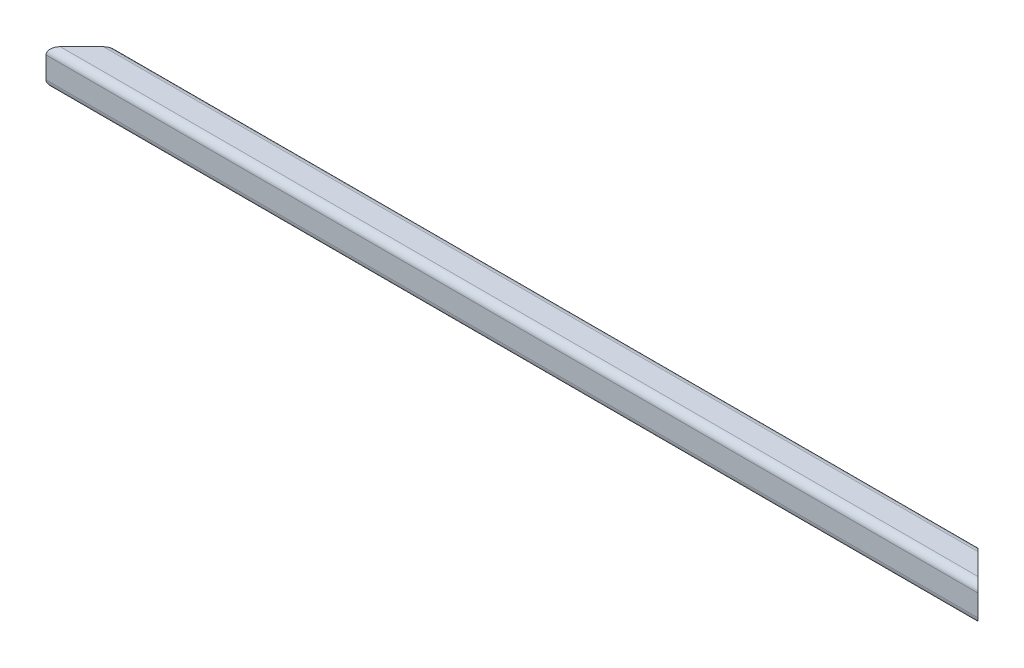
ISO-10303-21;
HEADER;
FILE_DESCRIPTION(('STEP AP214'),'2;1');
FILE_NAME('part.step','',(''),(''),'','','');
FILE_SCHEMA(('AUTOMOTIVE_DESIGN { 1 0 10303 214 1 1 1 1 }'));
ENDSEC;
DATA;
#1=APPLICATION_CONTEXT('core data for automotive mechanical design processes');
#2=APPLICATION_PROTOCOL_DEFINITION('international standard','automotive_design',2000,#1);
#3=PRODUCT_CONTEXT('',#1,'mechanical');
#4=PRODUCT('Part','Part','',(#3));
#5=PRODUCT_RELATED_PRODUCT_CATEGORY('part','',(#4));
#6=PRODUCT_DEFINITION_FORMATION('','',#4);
#7=PRODUCT_DEFINITION_CONTEXT('part definition',#1,'design');
#8=PRODUCT_DEFINITION('design','',#6,#7);
#9=PRODUCT_DEFINITION_SHAPE('','',#8);
#10=(LENGTH_UNIT() NAMED_UNIT(*) SI_UNIT(.MILLI.,.METRE.));
#11=(NAMED_UNIT(*) PLANE_ANGLE_UNIT() SI_UNIT($,.RADIAN.));
#12=(NAMED_UNIT(*) SI_UNIT($,.STERADIAN.) SOLID_ANGLE_UNIT());
#13=UNCERTAINTY_MEASURE_WITH_UNIT(LENGTH_MEASURE(1.E-05),#10,'distance_accuracy_value','');
#14=(GEOMETRIC_REPRESENTATION_CONTEXT(3) GLOBAL_UNCERTAINTY_ASSIGNED_CONTEXT((#13)) GLOBAL_UNIT_ASSIGNED_CONTEXT((#10,
#11,#12)) REPRESENTATION_CONTEXT('',''));
#15=CARTESIAN_POINT('',(0.,0.,0.));
#16=DIRECTION('',(0.,0.,1.));
#17=DIRECTION('',(1.,0.,0.));
#18=AXIS2_PLACEMENT_3D('',#15,#16,#17);
#19=CARTESIAN_POINT('',(-250.,226.,-1994.));
#20=DIRECTION('',(1.,0.,0.));
#21=DIRECTION('',(0.,0.,-1.));
#22=AXIS2_PLACEMENT_3D('',#19,#20,#21);
#23=CYLINDRICAL_SURFACE('',#22,4.);
#24=CARTESIAN_POINT('',(256.,226.,-1994.));
#25=DIRECTION('',(0.707106781186548,0.,-0.707106781186548));
#26=DIRECTION('',(0.707106781186547,0.,0.707106781186548));
#27=AXIS2_PLACEMENT_3D('',#24,#25,#26);
#28=ELLIPSE('',#27,5.65685424949238,4.);
#29=CARTESIAN_POINT('',(256.,230.,-1994.));
#30=VERTEX_POINT('',#29);
#31=CARTESIAN_POINT('',(260.,226.,-1990.));
#32=VERTEX_POINT('',#31);
#33=EDGE_CURVE('E185',#30,#32,#28,.T.);
#34=ORIENTED_EDGE('',*,*,#33,.F.);
#35=DIRECTION('',(1.,0.,0.));
#36=VECTOR('',#35,1.);
#37=CARTESIAN_POINT('',(-250.,230.,-1994.));
#38=LINE('',#37,#36);
#39=CARTESIAN_POINT('',(-256.,230.,-1994.));
#40=VERTEX_POINT('',#39);
#41=EDGE_CURVE('E265',#40,#30,#38,.T.);
#42=ORIENTED_EDGE('',*,*,#41,.F.);
#43=CARTESIAN_POINT('',(-256.,226.,-1994.));
#44=DIRECTION('',(-0.707106781186548,0.,-0.707106781186547));
#45=DIRECTION('',(0.707106781186547,0.,-0.707106781186548));
#46=AXIS2_PLACEMENT_3D('',#43,#44,#45);
#47=ELLIPSE('',#46,5.65685424949238,4.);
#48=CARTESIAN_POINT('',(-260.,226.,-1990.));
#49=VERTEX_POINT('',#48);
#50=EDGE_CURVE('E176',#49,#40,#47,.T.);
#51=ORIENTED_EDGE('',*,*,#50,.F.);
#52=DIRECTION('',(1.,0.,0.));
#53=VECTOR('',#52,1.);
#54=CARTESIAN_POINT('',(-250.,226.,-1990.));
#55=LINE('',#54,#53);
#56=EDGE_CURVE('E45',#49,#32,#55,.T.);
#57=ORIENTED_EDGE('',*,*,#56,.T.);
#58=EDGE_LOOP('',(#34,#42,#51,#57));
#59=FACE_BOUND('',#58,.T.);
#60=ADVANCED_FACE('F41',(#59),#23,.T.);
#61=CARTESIAN_POINT('',(-250.,230.,-1994.));
#62=DIRECTION('',(0.,-1.,0.));
#63=DIRECTION('',(0.,0.,-1.));
#64=AXIS2_PLACEMENT_3D('',#61,#62,#63);
#65=PLANE('',#64);
#66=DIRECTION('',(0.707106781186547,0.,0.707106781186548));
#67=VECTOR('',#66,1.);
#68=CARTESIAN_POINT('',(2.99999999999995,230.,-2247.));
#69=LINE('',#68,#67);
#70=CARTESIAN_POINT('',(244.,230.,-2006.));
#71=VERTEX_POINT('',#70);
#72=EDGE_CURVE('E182',#71,#30,#69,.T.);
#73=ORIENTED_EDGE('',*,*,#72,.F.);
#74=DIRECTION('',(1.,0.,0.));
#75=VECTOR('',#74,1.);
#76=CARTESIAN_POINT('',(-250.,230.,-2006.));
#77=LINE('',#76,#75);
#78=CARTESIAN_POINT('',(-244.,230.,-2006.));
#79=VERTEX_POINT('',#78);
#80=EDGE_CURVE('E263',#79,#71,#77,.T.);
#81=ORIENTED_EDGE('',*,*,#80,.F.);
#82=DIRECTION('',(0.707106781186547,0.,-0.707106781186548));
#83=VECTOR('',#82,1.);
#84=CARTESIAN_POINT('',(-253.,230.,-1997.));
#85=LINE('',#84,#83);
#86=EDGE_CURVE('E281',#40,#79,#85,.T.);
#87=ORIENTED_EDGE('',*,*,#86,.F.);
#88=ORIENTED_EDGE('',*,*,#41,.T.);
#89=EDGE_LOOP('',(#73,#81,#87,#88));
#90=FACE_BOUND('',#89,.T.);
#91=ADVANCED_FACE('F272',(#90),#65,.F.);
#92=CARTESIAN_POINT('',(-250.,226.,-2006.));
#93=DIRECTION('',(1.,0.,0.));
#94=DIRECTION('',(0.,0.,-1.));
#95=AXIS2_PLACEMENT_3D('',#92,#93,#94);
#96=CYLINDRICAL_SURFACE('',#95,4.);
#97=CARTESIAN_POINT('',(244.,226.,-2006.));
#98=DIRECTION('',(0.707106781186548,0.,-0.707106781186548));
#99=DIRECTION('',(0.707106781186547,0.,0.707106781186548));
#100=AXIS2_PLACEMENT_3D('',#97,#98,#99);
#101=ELLIPSE('',#100,5.65685424949238,4.);
#102=CARTESIAN_POINT('',(240.,226.,-2010.));
#103=VERTEX_POINT('',#102);
#104=EDGE_CURVE('E11',#103,#71,#101,.T.);
#105=ORIENTED_EDGE('',*,*,#104,.F.);
#106=DIRECTION('',(1.,0.,0.));
#107=VECTOR('',#106,1.);
#108=CARTESIAN_POINT('',(-250.,226.,-2010.));
#109=LINE('',#108,#107);
#110=CARTESIAN_POINT('',(-240.,226.,-2010.));
#111=VERTEX_POINT('',#110);
#112=EDGE_CURVE('E260',#111,#103,#109,.T.);
#113=ORIENTED_EDGE('',*,*,#112,.F.);
#114=CARTESIAN_POINT('',(-244.,226.,-2006.));
#115=DIRECTION('',(-0.707106781186548,0.,-0.707106781186547));
#116=DIRECTION('',(0.707106781186547,0.,-0.707106781186548));
#117=AXIS2_PLACEMENT_3D('',#114,#115,#116);
#118=ELLIPSE('',#117,5.65685424949238,4.);
#119=EDGE_CURVE('E278',#79,#111,#118,.T.);
#120=ORIENTED_EDGE('',*,*,#119,.F.);
#121=ORIENTED_EDGE('',*,*,#80,.T.);
#122=EDGE_LOOP('',(#105,#113,#120,#121));
#123=FACE_BOUND('',#122,.T.);
#124=ADVANCED_FACE('F275',(#123),#96,.T.);
#125=CARTESIAN_POINT('',(-250.,214.,-2010.));
#126=DIRECTION('',(0.,0.,1.));
#127=DIRECTION('',(1.,0.,0.));
#128=AXIS2_PLACEMENT_3D('',#125,#126,#127);
#129=PLANE('',#128);
#130=DIRECTION('',(0.,1.,0.));
#131=VECTOR('',#130,1.);
#132=CARTESIAN_POINT('',(240.,214.,-2010.));
#133=LINE('',#132,#131);
#134=CARTESIAN_POINT('',(240.,214.,-2010.));
#135=VERTEX_POINT('',#134);
#136=EDGE_CURVE('E51',#135,#103,#133,.T.);
#137=ORIENTED_EDGE('',*,*,#136,.F.);
#138=DIRECTION('',(1.,0.,0.));
#139=VECTOR('',#138,1.);
#140=CARTESIAN_POINT('',(-250.,214.,-2010.));
#141=LINE('',#140,#139);
#142=CARTESIAN_POINT('',(-240.,214.,-2010.));
#143=VERTEX_POINT('',#142);
#144=EDGE_CURVE('E257',#143,#135,#141,.T.);
#145=ORIENTED_EDGE('',*,*,#144,.F.);
#146=DIRECTION('',(0.,-1.,0.));
#147=VECTOR('',#146,1.);
#148=CARTESIAN_POINT('',(-240.,214.,-2010.));
#149=LINE('',#148,#147);
#150=EDGE_CURVE('E280',#111,#143,#149,.T.);
#151=ORIENTED_EDGE('',*,*,#150,.F.);
#152=ORIENTED_EDGE('',*,*,#112,.T.);
#153=EDGE_LOOP('',(#137,#145,#151,#152));
#154=FACE_BOUND('',#153,.T.);
#155=ADVANCED_FACE('F291',(#154),#129,.F.);
#156=CARTESIAN_POINT('',(-250.,214.,-2006.));
#157=DIRECTION('',(1.,0.,0.));
#158=DIRECTION('',(0.,0.,-1.));
#159=AXIS2_PLACEMENT_3D('',#156,#157,#158);
#160=CYLINDRICAL_SURFACE('',#159,4.);
#161=CARTESIAN_POINT('',(244.,214.,-2006.));
#162=DIRECTION('',(0.707106781186548,0.,-0.707106781186548));
#163=DIRECTION('',(0.707106781186547,0.,0.707106781186548));
#164=AXIS2_PLACEMENT_3D('',#161,#162,#163);
#165=ELLIPSE('',#164,5.65685424949238,4.);
#166=CARTESIAN_POINT('',(244.,210.,-2006.));
#167=VERTEX_POINT('',#166);
#168=EDGE_CURVE('E200',#167,#135,#165,.T.);
#169=ORIENTED_EDGE('',*,*,#168,.F.);
#170=DIRECTION('',(1.,0.,0.));
#171=VECTOR('',#170,1.);
#172=CARTESIAN_POINT('',(-250.,210.,-2006.));
#173=LINE('',#172,#171);
#174=CARTESIAN_POINT('',(-244.,210.,-2006.));
#175=VERTEX_POINT('',#174);
#176=EDGE_CURVE('E254',#175,#167,#173,.T.);
#177=ORIENTED_EDGE('',*,*,#176,.F.);
#178=CARTESIAN_POINT('',(-244.,214.,-2006.));
#179=DIRECTION('',(-0.707106781186548,0.,-0.707106781186547));
#180=DIRECTION('',(0.707106781186547,0.,-0.707106781186548));
#181=AXIS2_PLACEMENT_3D('',#178,#179,#180);
#182=ELLIPSE('',#181,5.65685424949238,4.);
#183=EDGE_CURVE('E187',#143,#175,#182,.T.);
#184=ORIENTED_EDGE('',*,*,#183,.F.);
#185=ORIENTED_EDGE('',*,*,#144,.T.);
#186=EDGE_LOOP('',(#169,#177,#184,#185));
#187=FACE_BOUND('',#186,.T.);
#188=ADVANCED_FACE('F289',(#187),#160,.T.);
#189=CARTESIAN_POINT('',(-250.,210.,-2006.));
#190=DIRECTION('',(0.,1.,0.));
#191=DIRECTION('',(0.,0.,1.));
#192=AXIS2_PLACEMENT_3D('',#189,#190,#191);
#193=PLANE('',#192);
#194=DIRECTION('',(-0.707106781186547,0.,-0.707106781186548));
#195=VECTOR('',#194,1.);
#196=CARTESIAN_POINT('',(-3.00000000000009,210.,-2253.));
#197=LINE('',#196,#195);
#198=CARTESIAN_POINT('',(256.,210.,-1994.));
#199=VERTEX_POINT('',#198);
#200=EDGE_CURVE('E203',#199,#167,#197,.T.);
#201=ORIENTED_EDGE('',*,*,#200,.F.);
#202=DIRECTION('',(1.,0.,0.));
#203=VECTOR('',#202,1.);
#204=CARTESIAN_POINT('',(-250.,210.,-1994.));
#205=LINE('',#204,#203);
#206=CARTESIAN_POINT('',(-256.,210.,-1994.));
#207=VERTEX_POINT('',#206);
#208=EDGE_CURVE('E252',#207,#199,#205,.T.);
#209=ORIENTED_EDGE('',*,*,#208,.F.);
#210=DIRECTION('',(-0.707106781186547,0.,0.707106781186548));
#211=VECTOR('',#210,1.);
#212=CARTESIAN_POINT('',(-247.,210.,-2003.));
#213=LINE('',#212,#211);
#214=EDGE_CURVE('E181',#175,#207,#213,.T.);
#215=ORIENTED_EDGE('',*,*,#214,.F.);
#216=ORIENTED_EDGE('',*,*,#176,.T.);
#217=EDGE_LOOP('',(#201,#209,#215,#216));
#218=FACE_BOUND('',#217,.T.);
#219=ADVANCED_FACE('F293',(#218),#193,.F.);
#220=CARTESIAN_POINT('',(-250.,214.,-1994.));
#221=DIRECTION('',(1.,0.,0.));
#222=DIRECTION('',(0.,0.,-1.));
#223=AXIS2_PLACEMENT_3D('',#220,#221,#222);
#224=CYLINDRICAL_SURFACE('',#223,4.);
#225=CARTESIAN_POINT('',(256.,214.,-1994.));
#226=DIRECTION('',(0.707106781186548,0.,-0.707106781186548));
#227=DIRECTION('',(0.707106781186547,0.,0.707106781186548));
#228=AXIS2_PLACEMENT_3D('',#225,#226,#227);
#229=ELLIPSE('',#228,5.65685424949238,4.);
#230=CARTESIAN_POINT('',(260.,214.,-1990.));
#231=VERTEX_POINT('',#230);
#232=EDGE_CURVE('E164',#231,#199,#229,.T.);
#233=ORIENTED_EDGE('',*,*,#232,.F.);
#234=DIRECTION('',(1.,0.,0.));
#235=VECTOR('',#234,1.);
#236=CARTESIAN_POINT('',(-250.,214.,-1990.));
#237=LINE('',#236,#235);
#238=CARTESIAN_POINT('',(-260.,214.,-1990.));
#239=VERTEX_POINT('',#238);
#240=EDGE_CURVE('E156',#239,#231,#237,.T.);
#241=ORIENTED_EDGE('',*,*,#240,.F.);
#242=CARTESIAN_POINT('',(-256.,214.,-1994.));
#243=DIRECTION('',(-0.707106781186548,0.,-0.707106781186547));
#244=DIRECTION('',(0.707106781186547,0.,-0.707106781186548));
#245=AXIS2_PLACEMENT_3D('',#242,#243,#244);
#246=ELLIPSE('',#245,5.65685424949238,4.);
#247=EDGE_CURVE('E161',#207,#239,#246,.T.);
#248=ORIENTED_EDGE('',*,*,#247,.F.);
#249=ORIENTED_EDGE('',*,*,#208,.T.);
#250=EDGE_LOOP('',(#233,#241,#248,#249));
#251=FACE_BOUND('',#250,.T.);
#252=ADVANCED_FACE('F158',(#251),#224,.T.);
#253=CARTESIAN_POINT('',(-250.,226.,-2006.));
#254=DIRECTION('',(1.,0.,0.));
#255=DIRECTION('',(0.,0.,-1.));
#256=AXIS2_PLACEMENT_3D('',#253,#254,#255);
#257=CYLINDRICAL_SURFACE('',#256,2.);
#258=DIRECTION('',(1.,0.,0.));
#259=VECTOR('',#258,1.);
#260=CARTESIAN_POINT('',(-250.,226.,-2008.));
#261=LINE('',#260,#259);
#262=CARTESIAN_POINT('',(-242.,226.,-2008.));
#263=VERTEX_POINT('',#262);
#264=CARTESIAN_POINT('',(242.,226.,-2008.));
#265=VERTEX_POINT('',#264);
#266=EDGE_CURVE('E209',#263,#265,#261,.T.);
#267=ORIENTED_EDGE('',*,*,#266,.T.);
#268=CARTESIAN_POINT('',(244.,226.,-2006.));
#269=DIRECTION('',(0.707106781186548,0.,-0.707106781186548));
#270=DIRECTION('',(0.707106781186547,0.,0.707106781186548));
#271=AXIS2_PLACEMENT_3D('',#268,#269,#270);
#272=ELLIPSE('',#271,2.82842712474619,2.);
#273=CARTESIAN_POINT('',(243.999999999999,228.,-2006.));
#274=VERTEX_POINT('',#273);
#275=EDGE_CURVE('E87',#265,#274,#272,.T.);
#276=ORIENTED_EDGE('',*,*,#275,.T.);
#277=DIRECTION('',(1.,0.,0.));
#278=VECTOR('',#277,1.);
#279=CARTESIAN_POINT('',(-250.,228.,-2006.));
#280=LINE('',#279,#278);
#281=CARTESIAN_POINT('',(-244.,228.,-2006.));
#282=VERTEX_POINT('',#281);
#283=EDGE_CURVE('E212',#282,#274,#280,.T.);
#284=ORIENTED_EDGE('',*,*,#283,.F.);
#285=CARTESIAN_POINT('',(-244.,226.,-2006.));
#286=DIRECTION('',(-0.707106781186548,0.,-0.707106781186547));
#287=DIRECTION('',(0.707106781186547,0.,-0.707106781186548));
#288=AXIS2_PLACEMENT_3D('',#285,#286,#287);
#289=ELLIPSE('',#288,2.82842712474619,2.);
#290=EDGE_CURVE('E208',#282,#263,#289,.T.);
#291=ORIENTED_EDGE('',*,*,#290,.T.);
#292=EDGE_LOOP('',(#267,#276,#284,#291));
#293=FACE_BOUND('',#292,.T.);
#294=ADVANCED_FACE('F300',(#293),#257,.F.);
#295=CARTESIAN_POINT('',(-250.,228.,-1994.));
#296=DIRECTION('',(0.,-1.,0.));
#297=DIRECTION('',(0.,0.,-1.));
#298=AXIS2_PLACEMENT_3D('',#295,#296,#297);
#299=PLANE('',#298);
#300=ORIENTED_EDGE('',*,*,#283,.T.);
#301=DIRECTION('',(0.707106781186547,0.,0.707106781186548));
#302=VECTOR('',#301,1.);
#303=CARTESIAN_POINT('',(2.99999999999995,228.,-2247.));
#304=LINE('',#303,#302);
#305=CARTESIAN_POINT('',(256.,228.,-1994.));
#306=VERTEX_POINT('',#305);
#307=EDGE_CURVE('E60',#274,#306,#304,.T.);
#308=ORIENTED_EDGE('',*,*,#307,.T.);
#309=DIRECTION('',(1.,0.,0.));
#310=VECTOR('',#309,1.);
#311=CARTESIAN_POINT('',(-250.,228.,-1994.));
#312=LINE('',#311,#310);
#313=CARTESIAN_POINT('',(-256.,228.,-1994.));
#314=VERTEX_POINT('',#313);
#315=EDGE_CURVE('E217',#314,#306,#312,.T.);
#316=ORIENTED_EDGE('',*,*,#315,.F.);
#317=DIRECTION('',(0.707106781186547,0.,-0.707106781186548));
#318=VECTOR('',#317,1.);
#319=CARTESIAN_POINT('',(-253.,228.,-1997.));
#320=LINE('',#319,#318);
#321=EDGE_CURVE('E211',#314,#282,#320,.T.);
#322=ORIENTED_EDGE('',*,*,#321,.T.);
#323=EDGE_LOOP('',(#300,#308,#316,#322));
#324=FACE_BOUND('',#323,.T.);
#325=ADVANCED_FACE('F342',(#324),#299,.T.);
#326=CARTESIAN_POINT('',(-250.,226.,-1994.));
#327=DIRECTION('',(1.,0.,0.));
#328=DIRECTION('',(0.,0.,-1.));
#329=AXIS2_PLACEMENT_3D('',#326,#327,#328);
#330=CYLINDRICAL_SURFACE('',#329,2.);
#331=ORIENTED_EDGE('',*,*,#315,.T.);
#332=CARTESIAN_POINT('',(256.,226.,-1994.));
#333=DIRECTION('',(0.707106781186548,0.,-0.707106781186548));
#334=DIRECTION('',(0.707106781186547,0.,0.707106781186548));
#335=AXIS2_PLACEMENT_3D('',#332,#333,#334);
#336=ELLIPSE('',#335,2.82842712474619,2.);
#337=CARTESIAN_POINT('',(258.,226.,-1992.));
#338=VERTEX_POINT('',#337);
#339=EDGE_CURVE('E213',#306,#338,#336,.T.);
#340=ORIENTED_EDGE('',*,*,#339,.T.);
#341=DIRECTION('',(1.,0.,0.));
#342=VECTOR('',#341,1.);
#343=CARTESIAN_POINT('',(-250.,226.,-1992.));
#344=LINE('',#343,#342);
#345=CARTESIAN_POINT('',(-258.,226.,-1992.));
#346=VERTEX_POINT('',#345);
#347=EDGE_CURVE('E222',#346,#338,#344,.T.);
#348=ORIENTED_EDGE('',*,*,#347,.F.);
#349=CARTESIAN_POINT('',(-256.,226.,-1994.));
#350=DIRECTION('',(-0.707106781186548,0.,-0.707106781186547));
#351=DIRECTION('',(0.707106781186547,0.,-0.707106781186548));
#352=AXIS2_PLACEMENT_3D('',#349,#350,#351);
#353=ELLIPSE('',#352,2.82842712474619,2.);
#354=EDGE_CURVE('E216',#346,#314,#353,.T.);
#355=ORIENTED_EDGE('',*,*,#354,.T.);
#356=EDGE_LOOP('',(#331,#340,#348,#355));
#357=FACE_BOUND('',#356,.T.);
#358=ADVANCED_FACE('F352',(#357),#330,.F.);
#359=CARTESIAN_POINT('',(-250.,226.,-1992.));
#360=DIRECTION('',(0.,0.,-1.));
#361=DIRECTION('',(-1.,0.,0.));
#362=AXIS2_PLACEMENT_3D('',#359,#360,#361);
#363=PLANE('',#362);
#364=ORIENTED_EDGE('',*,*,#347,.T.);
#365=DIRECTION('',(0.,-1.,0.));
#366=VECTOR('',#365,1.);
#367=CARTESIAN_POINT('',(258.,226.,-1992.));
#368=LINE('',#367,#366);
#369=CARTESIAN_POINT('',(258.,214.,-1992.));
#370=VERTEX_POINT('',#369);
#371=EDGE_CURVE('E218',#338,#370,#368,.T.);
#372=ORIENTED_EDGE('',*,*,#371,.T.);
#373=DIRECTION('',(1.,0.,0.));
#374=VECTOR('',#373,1.);
#375=CARTESIAN_POINT('',(-250.,214.,-1992.));
#376=LINE('',#375,#374);
#377=CARTESIAN_POINT('',(-258.,214.,-1992.));
#378=VERTEX_POINT('',#377);
#379=EDGE_CURVE('E227',#378,#370,#376,.T.);
#380=ORIENTED_EDGE('',*,*,#379,.F.);
#381=DIRECTION('',(0.,1.,0.));
#382=VECTOR('',#381,1.);
#383=CARTESIAN_POINT('',(-258.,226.,-1992.));
#384=LINE('',#383,#382);
#385=EDGE_CURVE('E221',#378,#346,#384,.T.);
#386=ORIENTED_EDGE('',*,*,#385,.T.);
#387=EDGE_LOOP('',(#364,#372,#380,#386));
#388=FACE_BOUND('',#387,.T.);
#389=ADVANCED_FACE('F362',(#388),#363,.T.);
#390=CARTESIAN_POINT('',(-250.,214.,-1994.));
#391=DIRECTION('',(1.,0.,0.));
#392=DIRECTION('',(0.,0.,-1.));
#393=AXIS2_PLACEMENT_3D('',#390,#391,#392);
#394=CYLINDRICAL_SURFACE('',#393,2.);
#395=ORIENTED_EDGE('',*,*,#379,.T.);
#396=CARTESIAN_POINT('',(256.,214.,-1994.));
#397=DIRECTION('',(0.707106781186548,0.,-0.707106781186548));
#398=DIRECTION('',(0.707106781186547,0.,0.707106781186548));
#399=AXIS2_PLACEMENT_3D('',#396,#397,#398);
#400=ELLIPSE('',#399,2.82842712474619,2.);
#401=CARTESIAN_POINT('',(256.,212.,-1994.));
#402=VERTEX_POINT('',#401);
#403=EDGE_CURVE('E223',#370,#402,#400,.T.);
#404=ORIENTED_EDGE('',*,*,#403,.T.);
#405=DIRECTION('',(1.,0.,0.));
#406=VECTOR('',#405,1.);
#407=CARTESIAN_POINT('',(-250.,212.,-1994.));
#408=LINE('',#407,#406);
#409=CARTESIAN_POINT('',(-256.,212.,-1994.));
#410=VERTEX_POINT('',#409);
#411=EDGE_CURVE('E232',#410,#402,#408,.T.);
#412=ORIENTED_EDGE('',*,*,#411,.F.);
#413=CARTESIAN_POINT('',(-256.,214.,-1994.));
#414=DIRECTION('',(-0.707106781186548,0.,-0.707106781186547));
#415=DIRECTION('',(0.707106781186547,0.,-0.707106781186548));
#416=AXIS2_PLACEMENT_3D('',#413,#414,#415);
#417=ELLIPSE('',#416,2.82842712474619,2.);
#418=EDGE_CURVE('E226',#410,#378,#417,.T.);
#419=ORIENTED_EDGE('',*,*,#418,.T.);
#420=EDGE_LOOP('',(#395,#404,#412,#419));
#421=FACE_BOUND('',#420,.T.);
#422=ADVANCED_FACE('F372',(#421),#394,.F.);
#423=CARTESIAN_POINT('',(-250.,212.,-2006.));
#424=DIRECTION('',(0.,1.,0.));
#425=DIRECTION('',(0.,0.,1.));
#426=AXIS2_PLACEMENT_3D('',#423,#424,#425);
#427=PLANE('',#426);
#428=ORIENTED_EDGE('',*,*,#411,.T.);
#429=DIRECTION('',(-0.707106781186547,0.,-0.707106781186548));
#430=VECTOR('',#429,1.);
#431=CARTESIAN_POINT('',(-3.00000000000009,212.,-2253.));
#432=LINE('',#431,#430);
#433=CARTESIAN_POINT('',(244.,212.,-2006.));
#434=VERTEX_POINT('',#433);
#435=EDGE_CURVE('E228',#402,#434,#432,.T.);
#436=ORIENTED_EDGE('',*,*,#435,.T.);
#437=DIRECTION('',(1.,0.,0.));
#438=VECTOR('',#437,1.);
#439=CARTESIAN_POINT('',(-250.,212.,-2006.));
#440=LINE('',#439,#438);
#441=CARTESIAN_POINT('',(-244.,212.,-2006.));
#442=VERTEX_POINT('',#441);
#443=EDGE_CURVE('E236',#442,#434,#440,.T.);
#444=ORIENTED_EDGE('',*,*,#443,.F.);
#445=DIRECTION('',(-0.707106781186547,0.,0.707106781186548));
#446=VECTOR('',#445,1.);
#447=CARTESIAN_POINT('',(-247.,212.,-2003.));
#448=LINE('',#447,#446);
#449=EDGE_CURVE('E231',#442,#410,#448,.T.);
#450=ORIENTED_EDGE('',*,*,#449,.T.);
#451=EDGE_LOOP('',(#428,#436,#444,#450));
#452=FACE_BOUND('',#451,.T.);
#453=ADVANCED_FACE('F382',(#452),#427,.T.);
#454=CARTESIAN_POINT('',(-250.,214.,-2006.));
#455=DIRECTION('',(1.,0.,0.));
#456=DIRECTION('',(0.,0.,-1.));
#457=AXIS2_PLACEMENT_3D('',#454,#455,#456);
#458=CYLINDRICAL_SURFACE('',#457,2.);
#459=ORIENTED_EDGE('',*,*,#443,.T.);
#460=CARTESIAN_POINT('',(244.,214.,-2006.));
#461=DIRECTION('',(0.707106781186548,0.,-0.707106781186548));
#462=DIRECTION('',(0.707106781186547,0.,0.707106781186548));
#463=AXIS2_PLACEMENT_3D('',#460,#461,#462);
#464=ELLIPSE('',#463,2.82842712474619,2.);
#465=CARTESIAN_POINT('',(242.,214.,-2008.));
#466=VERTEX_POINT('',#465);
#467=EDGE_CURVE('E233',#434,#466,#464,.T.);
#468=ORIENTED_EDGE('',*,*,#467,.T.);
#469=DIRECTION('',(1.,0.,0.));
#470=VECTOR('',#469,1.);
#471=CARTESIAN_POINT('',(-250.,214.,-2008.));
#472=LINE('',#471,#470);
#473=CARTESIAN_POINT('',(-242.,214.,-2008.));
#474=VERTEX_POINT('',#473);
#475=EDGE_CURVE('E194',#474,#466,#472,.T.);
#476=ORIENTED_EDGE('',*,*,#475,.F.);
#477=CARTESIAN_POINT('',(-244.,214.,-2006.));
#478=DIRECTION('',(-0.707106781186548,0.,-0.707106781186547));
#479=DIRECTION('',(0.707106781186547,0.,-0.707106781186548));
#480=AXIS2_PLACEMENT_3D('',#477,#478,#479);
#481=ELLIPSE('',#480,2.82842712474619,2.);
#482=EDGE_CURVE('E235',#474,#442,#481,.T.);
#483=ORIENTED_EDGE('',*,*,#482,.T.);
#484=EDGE_LOOP('',(#459,#468,#476,#483));
#485=FACE_BOUND('',#484,.T.);
#486=ADVANCED_FACE('F392',(#485),#458,.F.);
#487=CARTESIAN_POINT('',(-250.,214.,-2008.));
#488=DIRECTION('',(0.,0.,1.));
#489=DIRECTION('',(1.,0.,0.));
#490=AXIS2_PLACEMENT_3D('',#487,#488,#489);
#491=PLANE('',#490);
#492=ORIENTED_EDGE('',*,*,#475,.T.);
#493=DIRECTION('',(0.,1.,0.));
#494=VECTOR('',#493,1.);
#495=CARTESIAN_POINT('',(242.,214.,-2008.));
#496=LINE('',#495,#494);
#497=EDGE_CURVE('E82',#466,#265,#496,.T.);
#498=ORIENTED_EDGE('',*,*,#497,.T.);
#499=ORIENTED_EDGE('',*,*,#266,.F.);
#500=DIRECTION('',(0.,-1.,0.));
#501=VECTOR('',#500,1.);
#502=CARTESIAN_POINT('',(-242.,214.,-2008.));
#503=LINE('',#502,#501);
#504=EDGE_CURVE('E169',#263,#474,#503,.T.);
#505=ORIENTED_EDGE('',*,*,#504,.T.);
#506=EDGE_LOOP('',(#492,#498,#499,#505));
#507=FACE_BOUND('',#506,.T.);
#508=ADVANCED_FACE('F402',(#507),#491,.T.);
#509=CARTESIAN_POINT('',(-250.,226.,-1990.));
#510=DIRECTION('',(0.,0.,-1.));
#511=DIRECTION('',(-1.,0.,0.));
#512=AXIS2_PLACEMENT_3D('',#509,#510,#511);
#513=PLANE('',#512);
#514=DIRECTION('',(0.,-1.,0.));
#515=VECTOR('',#514,1.);
#516=CARTESIAN_POINT('',(260.,226.,-1990.));
#517=LINE('',#516,#515);
#518=EDGE_CURVE('E196',#32,#231,#517,.T.);
#519=ORIENTED_EDGE('',*,*,#518,.F.);
#520=ORIENTED_EDGE('',*,*,#56,.F.);
#521=DIRECTION('',(0.,1.,0.));
#522=VECTOR('',#521,1.);
#523=CARTESIAN_POINT('',(-260.,226.,-1990.));
#524=LINE('',#523,#522);
#525=EDGE_CURVE('E168',#239,#49,#524,.T.);
#526=ORIENTED_EDGE('',*,*,#525,.F.);
#527=ORIENTED_EDGE('',*,*,#240,.T.);
#528=EDGE_LOOP('',(#519,#520,#526,#527));
#529=FACE_BOUND('',#528,.T.);
#530=ADVANCED_FACE('F172',(#529),#513,.F.);
#531=CARTESIAN_POINT('',(-250.,220.,-2000.));
#532=DIRECTION('',(-0.707106781186548,0.,-0.707106781186547));
#533=DIRECTION('',(-0.707106781186547,0.,0.707106781186548));
#534=AXIS2_PLACEMENT_3D('',#531,#532,#533);
#535=PLANE('',#534);
#536=ORIENTED_EDGE('',*,*,#290,.F.);
#537=ORIENTED_EDGE('',*,*,#321,.F.);
#538=ORIENTED_EDGE('',*,*,#354,.F.);
#539=ORIENTED_EDGE('',*,*,#385,.F.);
#540=ORIENTED_EDGE('',*,*,#418,.F.);
#541=ORIENTED_EDGE('',*,*,#449,.F.);
#542=ORIENTED_EDGE('',*,*,#482,.F.);
#543=ORIENTED_EDGE('',*,*,#504,.F.);
#544=EDGE_LOOP('',(#536,#537,#538,#539,#540,#541,#542,#543));
#545=FACE_BOUND('',#544,.T.);
#546=ORIENTED_EDGE('',*,*,#525,.T.);
#547=ORIENTED_EDGE('',*,*,#50,.T.);
#548=ORIENTED_EDGE('',*,*,#86,.T.);
#549=ORIENTED_EDGE('',*,*,#119,.T.);
#550=ORIENTED_EDGE('',*,*,#150,.T.);
#551=ORIENTED_EDGE('',*,*,#183,.T.);
#552=ORIENTED_EDGE('',*,*,#214,.T.);
#553=ORIENTED_EDGE('',*,*,#247,.T.);
#554=EDGE_LOOP('',(#546,#547,#548,#549,#550,#551,#552,#553));
#555=FACE_BOUND('',#554,.T.);
#556=ADVANCED_FACE('F179',(#545,#555),#535,.T.);
#557=CARTESIAN_POINT('',(250.,220.,-2000.));
#558=DIRECTION('',(0.707106781186548,0.,-0.707106781186548));
#559=DIRECTION('',(-0.707106781186547,0.,-0.707106781186548));
#560=AXIS2_PLACEMENT_3D('',#557,#558,#559);
#561=PLANE('',#560);
#562=ORIENTED_EDGE('',*,*,#275,.F.);
#563=ORIENTED_EDGE('',*,*,#497,.F.);
#564=ORIENTED_EDGE('',*,*,#467,.F.);
#565=ORIENTED_EDGE('',*,*,#435,.F.);
#566=ORIENTED_EDGE('',*,*,#403,.F.);
#567=ORIENTED_EDGE('',*,*,#371,.F.);
#568=ORIENTED_EDGE('',*,*,#339,.F.);
#569=ORIENTED_EDGE('',*,*,#307,.F.);
#570=EDGE_LOOP('',(#562,#563,#564,#565,#566,#567,#568,#569));
#571=FACE_BOUND('',#570,.T.);
#572=ORIENTED_EDGE('',*,*,#72,.T.);
#573=ORIENTED_EDGE('',*,*,#33,.T.);
#574=ORIENTED_EDGE('',*,*,#518,.T.);
#575=ORIENTED_EDGE('',*,*,#232,.T.);
#576=ORIENTED_EDGE('',*,*,#200,.T.);
#577=ORIENTED_EDGE('',*,*,#168,.T.);
#578=ORIENTED_EDGE('',*,*,#136,.T.);
#579=ORIENTED_EDGE('',*,*,#104,.T.);
#580=EDGE_LOOP('',(#572,#573,#574,#575,#576,#577,#578,#579));
#581=FACE_BOUND('',#580,.T.);
#582=ADVANCED_FACE('F43',(#571,#581),#561,.T.);
#583=CLOSED_SHELL('',(#60,#91,#124,#155,#188,#219,#252,#294,#325,#358,#389,#422,#453,#486,#508,
#530,#556,#582));
#584=MANIFOLD_SOLID_BREP('B2',#583);
#585=ADVANCED_BREP_SHAPE_REPRESENTATION('',(#18,#584),#14);
#586=SHAPE_DEFINITION_REPRESENTATION(#9,#585);
ENDSEC;
END-ISO-10303-21;
